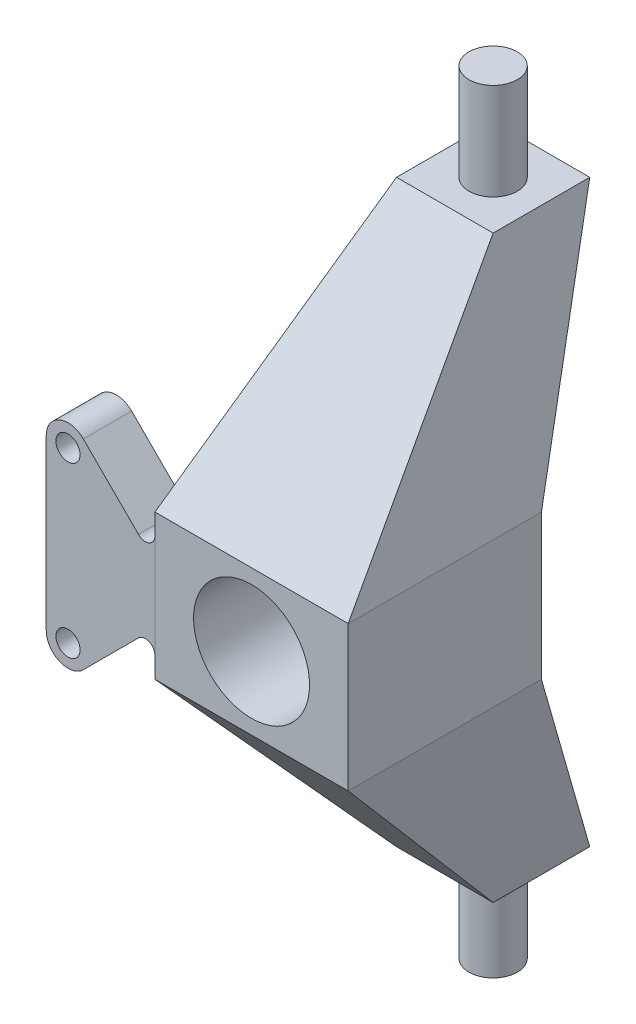
ISO-10303-21;
HEADER;
FILE_DESCRIPTION(('STEP AP214'),'2;1');
FILE_NAME('part.step','',(''),(''),'','','');
FILE_SCHEMA(('AUTOMOTIVE_DESIGN { 1 0 10303 214 1 1 1 1 }'));
ENDSEC;
DATA;
#1=APPLICATION_CONTEXT('core data for automotive mechanical design processes');
#2=APPLICATION_PROTOCOL_DEFINITION('international standard','automotive_design',2000,#1);
#3=PRODUCT_CONTEXT('',#1,'mechanical');
#4=PRODUCT('Part','Part','',(#3));
#5=PRODUCT_RELATED_PRODUCT_CATEGORY('part','',(#4));
#6=PRODUCT_DEFINITION_FORMATION('','',#4);
#7=PRODUCT_DEFINITION_CONTEXT('part definition',#1,'design');
#8=PRODUCT_DEFINITION('design','',#6,#7);
#9=PRODUCT_DEFINITION_SHAPE('','',#8);
#10=(LENGTH_UNIT() NAMED_UNIT(*) SI_UNIT(.MILLI.,.METRE.));
#11=(NAMED_UNIT(*) PLANE_ANGLE_UNIT() SI_UNIT($,.RADIAN.));
#12=(NAMED_UNIT(*) SI_UNIT($,.STERADIAN.) SOLID_ANGLE_UNIT());
#13=UNCERTAINTY_MEASURE_WITH_UNIT(LENGTH_MEASURE(1.E-05),#10,'distance_accuracy_value','');
#14=(GEOMETRIC_REPRESENTATION_CONTEXT(3) GLOBAL_UNCERTAINTY_ASSIGNED_CONTEXT((#13)) GLOBAL_UNIT_ASSIGNED_CONTEXT((#10,
#11,#12)) REPRESENTATION_CONTEXT('',''));
#15=CARTESIAN_POINT('',(0.,0.,0.));
#16=DIRECTION('',(0.,0.,1.));
#17=DIRECTION('',(1.,0.,0.));
#18=AXIS2_PLACEMENT_3D('',#15,#16,#17);
#19=CARTESIAN_POINT('',(-38.,17.5,10.));
#20=DIRECTION('',(0.,0.,1.));
#21=DIRECTION('',(1.,0.,0.));
#22=AXIS2_PLACEMENT_3D('',#19,#20,#21);
#23=CYLINDRICAL_SURFACE('',#22,4.50000000000001);
#24=CARTESIAN_POINT('',(-38.,17.5,20.));
#25=DIRECTION('',(0.,0.,1.));
#26=DIRECTION('',(1.,0.,0.));
#27=AXIS2_PLACEMENT_3D('',#24,#25,#26);
#28=CIRCLE('',#27,4.50000000000001);
#29=CARTESIAN_POINT('',(-42.5,17.5,20.));
#30=VERTEX_POINT('',#29);
#31=CARTESIAN_POINT('',(-34.8180194846605,20.6819805153395,20.));
#32=VERTEX_POINT('',#31);
#33=EDGE_CURVE('E150',#30,#32,#28,.F.);
#34=ORIENTED_EDGE('',*,*,#33,.T.);
#35=DIRECTION('',(0.,0.,1.));
#36=VECTOR('',#35,1.);
#37=CARTESIAN_POINT('',(-34.8180194846605,20.6819805153395,10.));
#38=LINE('',#37,#36);
#39=CARTESIAN_POINT('',(-34.8180194846605,20.6819805153395,10.));
#40=VERTEX_POINT('',#39);
#41=EDGE_CURVE('E12',#40,#32,#38,.T.);
#42=ORIENTED_EDGE('',*,*,#41,.F.);
#43=CARTESIAN_POINT('',(-38.,17.5,10.));
#44=DIRECTION('',(0.,0.,1.));
#45=DIRECTION('',(1.,0.,0.));
#46=AXIS2_PLACEMENT_3D('',#43,#44,#45);
#47=CIRCLE('',#46,4.50000000000001);
#48=CARTESIAN_POINT('',(-42.5,17.5,10.));
#49=VERTEX_POINT('',#48);
#50=EDGE_CURVE('E68',#49,#40,#47,.F.);
#51=ORIENTED_EDGE('',*,*,#50,.F.);
#52=DIRECTION('',(0.,0.,1.));
#53=VECTOR('',#52,1.);
#54=CARTESIAN_POINT('',(-42.5,17.5,10.));
#55=LINE('',#54,#53);
#56=EDGE_CURVE('E53',#49,#30,#55,.T.);
#57=ORIENTED_EDGE('',*,*,#56,.T.);
#58=EDGE_LOOP('',(#34,#42,#51,#57));
#59=FACE_BOUND('',#58,.T.);
#60=ADVANCED_FACE('F49',(#59),#23,.T.);
#61=CARTESIAN_POINT('',(-7.06801948466046,-7.06801948466049,10.));
#62=DIRECTION('',(0.707106781186546,0.707106781186549,0.));
#63=DIRECTION('',(-0.707106781186549,0.707106781186546,0.));
#64=AXIS2_PLACEMENT_3D('',#61,#62,#63);
#65=PLANE('',#64);
#66=DIRECTION('',(-0.707106781186549,0.707106781186546,0.));
#67=VECTOR('',#66,1.);
#68=CARTESIAN_POINT('',(-7.06801948466046,-7.06801948466049,20.));
#69=LINE('',#68,#67);
#70=CARTESIAN_POINT('',(-23.4142135623731,9.27817459305209,20.));
#71=VERTEX_POINT('',#70);
#72=EDGE_CURVE('E167',#71,#32,#69,.T.);
#73=ORIENTED_EDGE('',*,*,#72,.F.);
#74=DIRECTION('',(0.,0.,1.));
#75=VECTOR('',#74,1.);
#76=CARTESIAN_POINT('',(-23.4142135623731,9.27817459305209,10.));
#77=LINE('',#76,#75);
#78=CARTESIAN_POINT('',(-23.4142135623731,9.27817459305209,10.));
#79=VERTEX_POINT('',#78);
#80=EDGE_CURVE('E59',#79,#71,#77,.T.);
#81=ORIENTED_EDGE('',*,*,#80,.F.);
#82=DIRECTION('',(-0.707106781186549,0.707106781186546,0.));
#83=VECTOR('',#82,1.);
#84=CARTESIAN_POINT('',(-7.06801948466046,-7.06801948466049,10.));
#85=LINE('',#84,#83);
#86=EDGE_CURVE('E139',#79,#40,#85,.T.);
#87=ORIENTED_EDGE('',*,*,#86,.T.);
#88=ORIENTED_EDGE('',*,*,#41,.T.);
#89=EDGE_LOOP('',(#73,#81,#87,#88));
#90=FACE_BOUND('',#89,.T.);
#91=ADVANCED_FACE('F197',(#90),#65,.T.);
#92=CARTESIAN_POINT('',(-22.,10.6923881554252,10.));
#93=DIRECTION('',(0.,0.,1.));
#94=DIRECTION('',(1.,0.,0.));
#95=AXIS2_PLACEMENT_3D('',#92,#93,#94);
#96=CYLINDRICAL_SURFACE('',#95,2.);
#97=CARTESIAN_POINT('',(-22.,10.6923881554252,20.));
#98=DIRECTION('',(0.,0.,1.));
#99=DIRECTION('',(1.,0.,0.));
#100=AXIS2_PLACEMENT_3D('',#97,#98,#99);
#101=CIRCLE('',#100,2.);
#102=CARTESIAN_POINT('',(-20.,10.6923881554252,20.));
#103=VERTEX_POINT('',#102);
#104=EDGE_CURVE('E126',#103,#71,#101,.F.);
#105=ORIENTED_EDGE('',*,*,#104,.F.);
#106=DIRECTION('',(0.,0.,1.));
#107=VECTOR('',#106,1.);
#108=CARTESIAN_POINT('',(-20.,10.6923881554252,10.));
#109=LINE('',#108,#107);
#110=CARTESIAN_POINT('',(-20.,10.6923881554252,10.));
#111=VERTEX_POINT('',#110);
#112=EDGE_CURVE('E121',#111,#103,#109,.T.);
#113=ORIENTED_EDGE('',*,*,#112,.F.);
#114=CARTESIAN_POINT('',(-22.,10.6923881554252,10.));
#115=DIRECTION('',(0.,0.,1.));
#116=DIRECTION('',(1.,0.,0.));
#117=AXIS2_PLACEMENT_3D('',#114,#115,#116);
#118=CIRCLE('',#117,2.);
#119=EDGE_CURVE('E125',#111,#79,#118,.F.);
#120=ORIENTED_EDGE('',*,*,#119,.T.);
#121=ORIENTED_EDGE('',*,*,#80,.T.);
#122=EDGE_LOOP('',(#105,#113,#120,#121));
#123=FACE_BOUND('',#122,.T.);
#124=ADVANCED_FACE('F123',(#123),#96,.F.);
#125=CARTESIAN_POINT('',(-20.,0.,10.));
#126=DIRECTION('',(-1.,0.,0.));
#127=DIRECTION('',(0.,0.,1.));
#128=AXIS2_PLACEMENT_3D('',#125,#126,#127);
#129=PLANE('',#128);
#130=DIRECTION('',(0.,-1.,0.));
#131=VECTOR('',#130,1.);
#132=CARTESIAN_POINT('',(-20.,0.,20.));
#133=LINE('',#132,#131);
#134=CARTESIAN_POINT('',(-20.,-10.6923881554251,20.));
#135=VERTEX_POINT('',#134);
#136=EDGE_CURVE('E164',#103,#135,#133,.T.);
#137=ORIENTED_EDGE('',*,*,#136,.T.);
#138=DIRECTION('',(0.,0.,1.));
#139=VECTOR('',#138,1.);
#140=CARTESIAN_POINT('',(-20.,-10.6923881554251,10.));
#141=LINE('',#140,#139);
#142=CARTESIAN_POINT('',(-20.,-10.6923881554251,10.));
#143=VERTEX_POINT('',#142);
#144=EDGE_CURVE('E129',#143,#135,#141,.T.);
#145=ORIENTED_EDGE('',*,*,#144,.F.);
#146=DIRECTION('',(0.,-1.,0.));
#147=VECTOR('',#146,1.);
#148=CARTESIAN_POINT('',(-20.,0.,10.));
#149=LINE('',#148,#147);
#150=EDGE_CURVE('E132',#111,#143,#149,.T.);
#151=ORIENTED_EDGE('',*,*,#150,.F.);
#152=ORIENTED_EDGE('',*,*,#112,.T.);
#153=EDGE_LOOP('',(#137,#145,#151,#152));
#154=FACE_BOUND('',#153,.T.);
#155=ADVANCED_FACE('F133',(#154),#129,.F.);
#156=CARTESIAN_POINT('',(-22.,-10.6923881554251,10.));
#157=DIRECTION('',(0.,0.,1.));
#158=DIRECTION('',(1.,0.,0.));
#159=AXIS2_PLACEMENT_3D('',#156,#157,#158);
#160=CYLINDRICAL_SURFACE('',#159,2.);
#161=CARTESIAN_POINT('',(-22.,-10.6923881554251,20.));
#162=DIRECTION('',(0.,0.,1.));
#163=DIRECTION('',(1.,0.,0.));
#164=AXIS2_PLACEMENT_3D('',#161,#162,#163);
#165=CIRCLE('',#164,2.);
#166=CARTESIAN_POINT('',(-23.4142135623731,-9.27817459305205,20.));
#167=VERTEX_POINT('',#166);
#168=EDGE_CURVE('E161',#135,#167,#165,.T.);
#169=ORIENTED_EDGE('',*,*,#168,.T.);
#170=DIRECTION('',(0.,0.,1.));
#171=VECTOR('',#170,1.);
#172=CARTESIAN_POINT('',(-23.4142135623731,-9.27817459305205,10.));
#173=LINE('',#172,#171);
#174=CARTESIAN_POINT('',(-23.4142135623731,-9.27817459305205,10.));
#175=VERTEX_POINT('',#174);
#176=EDGE_CURVE('E173',#175,#167,#173,.T.);
#177=ORIENTED_EDGE('',*,*,#176,.F.);
#178=CARTESIAN_POINT('',(-22.,-10.6923881554251,10.));
#179=DIRECTION('',(0.,0.,1.));
#180=DIRECTION('',(1.,0.,0.));
#181=AXIS2_PLACEMENT_3D('',#178,#179,#180);
#182=CIRCLE('',#181,2.);
#183=EDGE_CURVE('E136',#143,#175,#182,.T.);
#184=ORIENTED_EDGE('',*,*,#183,.F.);
#185=ORIENTED_EDGE('',*,*,#144,.T.);
#186=EDGE_LOOP('',(#169,#177,#184,#185));
#187=FACE_BOUND('',#186,.T.);
#188=ADVANCED_FACE('F227',(#187),#160,.F.);
#189=CARTESIAN_POINT('',(-7.06801948466048,7.06801948466051,10.));
#190=DIRECTION('',(0.707106781186546,-0.707106781186549,0.));
#191=DIRECTION('',(0.707106781186549,0.707106781186546,0.));
#192=AXIS2_PLACEMENT_3D('',#189,#190,#191);
#193=PLANE('',#192);
#194=DIRECTION('',(0.707106781186549,0.707106781186546,0.));
#195=VECTOR('',#194,1.);
#196=CARTESIAN_POINT('',(-7.06801948466048,7.06801948466051,20.));
#197=LINE('',#196,#195);
#198=CARTESIAN_POINT('',(-34.8180194846605,-20.6819805153395,20.));
#199=VERTEX_POINT('',#198);
#200=EDGE_CURVE('E158',#199,#167,#197,.T.);
#201=ORIENTED_EDGE('',*,*,#200,.F.);
#202=DIRECTION('',(0.,0.,1.));
#203=VECTOR('',#202,1.);
#204=CARTESIAN_POINT('',(-34.8180194846605,-20.6819805153395,10.));
#205=LINE('',#204,#203);
#206=CARTESIAN_POINT('',(-34.8180194846605,-20.6819805153395,10.));
#207=VERTEX_POINT('',#206);
#208=EDGE_CURVE('E175',#207,#199,#205,.T.);
#209=ORIENTED_EDGE('',*,*,#208,.F.);
#210=DIRECTION('',(0.707106781186549,0.707106781186546,0.));
#211=VECTOR('',#210,1.);
#212=CARTESIAN_POINT('',(-7.06801948466048,7.06801948466051,10.));
#213=LINE('',#212,#211);
#214=EDGE_CURVE('E242',#207,#175,#213,.T.);
#215=ORIENTED_EDGE('',*,*,#214,.T.);
#216=ORIENTED_EDGE('',*,*,#176,.T.);
#217=EDGE_LOOP('',(#201,#209,#215,#216));
#218=FACE_BOUND('',#217,.T.);
#219=ADVANCED_FACE('F208',(#218),#193,.T.);
#220=CARTESIAN_POINT('',(-38.,-17.5,10.));
#221=DIRECTION('',(0.,0.,1.));
#222=DIRECTION('',(1.,0.,0.));
#223=AXIS2_PLACEMENT_3D('',#220,#221,#222);
#224=CYLINDRICAL_SURFACE('',#223,4.50000000000001);
#225=CARTESIAN_POINT('',(-38.,-17.5,20.));
#226=DIRECTION('',(0.,0.,1.));
#227=DIRECTION('',(1.,0.,0.));
#228=AXIS2_PLACEMENT_3D('',#225,#226,#227);
#229=CIRCLE('',#228,4.50000000000001);
#230=CARTESIAN_POINT('',(-42.5,-17.5,20.));
#231=VERTEX_POINT('',#230);
#232=EDGE_CURVE('E155',#199,#231,#229,.F.);
#233=ORIENTED_EDGE('',*,*,#232,.T.);
#234=DIRECTION('',(0.,0.,1.));
#235=VECTOR('',#234,1.);
#236=CARTESIAN_POINT('',(-42.5,-17.5,10.));
#237=LINE('',#236,#235);
#238=CARTESIAN_POINT('',(-42.5,-17.5,10.));
#239=VERTEX_POINT('',#238);
#240=EDGE_CURVE('E176',#239,#231,#237,.T.);
#241=ORIENTED_EDGE('',*,*,#240,.F.);
#242=CARTESIAN_POINT('',(-38.,-17.5,10.));
#243=DIRECTION('',(0.,0.,1.));
#244=DIRECTION('',(1.,0.,0.));
#245=AXIS2_PLACEMENT_3D('',#242,#243,#244);
#246=CIRCLE('',#245,4.50000000000001);
#247=EDGE_CURVE('E240',#207,#239,#246,.F.);
#248=ORIENTED_EDGE('',*,*,#247,.F.);
#249=ORIENTED_EDGE('',*,*,#208,.T.);
#250=EDGE_LOOP('',(#233,#241,#248,#249));
#251=FACE_BOUND('',#250,.T.);
#252=ADVANCED_FACE('F203',(#251),#224,.T.);
#253=CARTESIAN_POINT('',(-38.,17.5,10.));
#254=DIRECTION('',(0.,0.,1.));
#255=DIRECTION('',(1.,0.,0.));
#256=AXIS2_PLACEMENT_3D('',#253,#254,#255);
#257=CYLINDRICAL_SURFACE('',#256,2.5);
#258=CARTESIAN_POINT('',(-38.,17.5,10.));
#259=DIRECTION('',(0.,0.,1.));
#260=DIRECTION('',(1.,0.,0.));
#261=AXIS2_PLACEMENT_3D('',#258,#259,#260);
#262=CIRCLE('',#261,2.5);
#263=CARTESIAN_POINT('',(-35.5,17.5,10.));
#264=VERTEX_POINT('',#263);
#265=EDGE_CURVE('E213',#264,#264,#262,.T.);
#266=ORIENTED_EDGE('',*,*,#265,.F.);
#267=EDGE_LOOP('',(#266));
#268=FACE_BOUND('',#267,.T.);
#269=CARTESIAN_POINT('',(-38.,17.5,20.));
#270=DIRECTION('',(0.,0.,1.));
#271=DIRECTION('',(1.,0.,0.));
#272=AXIS2_PLACEMENT_3D('',#269,#270,#271);
#273=CIRCLE('',#272,2.5);
#274=CARTESIAN_POINT('',(-35.5,17.5,20.));
#275=VERTEX_POINT('',#274);
#276=EDGE_CURVE('E147',#275,#275,#273,.T.);
#277=ORIENTED_EDGE('',*,*,#276,.T.);
#278=EDGE_LOOP('',(#277));
#279=FACE_BOUND('',#278,.T.);
#280=ADVANCED_FACE('F192',(#268,#279),#257,.F.);
#281=CARTESIAN_POINT('',(-38.,-17.5,10.));
#282=DIRECTION('',(0.,0.,1.));
#283=DIRECTION('',(1.,0.,0.));
#284=AXIS2_PLACEMENT_3D('',#281,#282,#283);
#285=CYLINDRICAL_SURFACE('',#284,2.5);
#286=CARTESIAN_POINT('',(-38.,-17.5,10.));
#287=DIRECTION('',(0.,0.,1.));
#288=DIRECTION('',(1.,0.,0.));
#289=AXIS2_PLACEMENT_3D('',#286,#287,#288);
#290=CIRCLE('',#289,2.5);
#291=CARTESIAN_POINT('',(-35.5,-17.5,10.));
#292=VERTEX_POINT('',#291);
#293=EDGE_CURVE('E169',#292,#292,#290,.T.);
#294=ORIENTED_EDGE('',*,*,#293,.F.);
#295=EDGE_LOOP('',(#294));
#296=FACE_BOUND('',#295,.T.);
#297=CARTESIAN_POINT('',(-38.,-17.5,20.));
#298=DIRECTION('',(0.,0.,1.));
#299=DIRECTION('',(1.,0.,0.));
#300=AXIS2_PLACEMENT_3D('',#297,#298,#299);
#301=CIRCLE('',#300,2.5);
#302=CARTESIAN_POINT('',(-35.5,-17.5,20.));
#303=VERTEX_POINT('',#302);
#304=EDGE_CURVE('E144',#303,#303,#301,.T.);
#305=ORIENTED_EDGE('',*,*,#304,.T.);
#306=EDGE_LOOP('',(#305));
#307=FACE_BOUND('',#306,.T.);
#308=ADVANCED_FACE('F51',(#296,#307),#285,.F.);
#309=CARTESIAN_POINT('',(-42.5,0.,10.));
#310=DIRECTION('',(-1.,0.,0.));
#311=DIRECTION('',(0.,0.,1.));
#312=AXIS2_PLACEMENT_3D('',#309,#310,#311);
#313=PLANE('',#312);
#314=DIRECTION('',(0.,-1.,0.));
#315=VECTOR('',#314,1.);
#316=CARTESIAN_POINT('',(-42.5,0.,20.));
#317=LINE('',#316,#315);
#318=EDGE_CURVE('E152',#30,#231,#317,.T.);
#319=ORIENTED_EDGE('',*,*,#318,.F.);
#320=ORIENTED_EDGE('',*,*,#56,.F.);
#321=DIRECTION('',(0.,-1.,0.));
#322=VECTOR('',#321,1.);
#323=CARTESIAN_POINT('',(-42.5,0.,10.));
#324=LINE('',#323,#322);
#325=EDGE_CURVE('E243',#49,#239,#324,.T.);
#326=ORIENTED_EDGE('',*,*,#325,.T.);
#327=ORIENTED_EDGE('',*,*,#240,.T.);
#328=EDGE_LOOP('',(#319,#320,#326,#327));
#329=FACE_BOUND('',#328,.T.);
#330=ADVANCED_FACE('F183',(#329),#313,.T.);
#331=CARTESIAN_POINT('',(0.,0.,10.));
#332=DIRECTION('',(0.,0.,1.));
#333=DIRECTION('',(1.,0.,0.));
#334=AXIS2_PLACEMENT_3D('',#331,#332,#333);
#335=PLANE('',#334);
#336=ORIENTED_EDGE('',*,*,#293,.T.);
#337=EDGE_LOOP('',(#336));
#338=FACE_BOUND('',#337,.T.);
#339=ORIENTED_EDGE('',*,*,#265,.T.);
#340=EDGE_LOOP('',(#339));
#341=FACE_BOUND('',#340,.T.);
#342=ORIENTED_EDGE('',*,*,#50,.T.);
#343=ORIENTED_EDGE('',*,*,#86,.F.);
#344=ORIENTED_EDGE('',*,*,#119,.F.);
#345=ORIENTED_EDGE('',*,*,#150,.T.);
#346=ORIENTED_EDGE('',*,*,#183,.T.);
#347=ORIENTED_EDGE('',*,*,#214,.F.);
#348=ORIENTED_EDGE('',*,*,#247,.T.);
#349=ORIENTED_EDGE('',*,*,#325,.F.);
#350=EDGE_LOOP('',(#342,#343,#344,#345,#346,#347,#348,#349));
#351=FACE_BOUND('',#350,.T.);
#352=ADVANCED_FACE('F138',(#338,#341,#351),#335,.F.);
#353=CARTESIAN_POINT('',(0.,0.,20.));
#354=DIRECTION('',(0.,0.,1.));
#355=DIRECTION('',(1.,0.,0.));
#356=AXIS2_PLACEMENT_3D('',#353,#354,#355);
#357=PLANE('',#356);
#358=ORIENTED_EDGE('',*,*,#304,.F.);
#359=EDGE_LOOP('',(#358));
#360=FACE_BOUND('',#359,.T.);
#361=ORIENTED_EDGE('',*,*,#276,.F.);
#362=EDGE_LOOP('',(#361));
#363=FACE_BOUND('',#362,.T.);
#364=ORIENTED_EDGE('',*,*,#33,.F.);
#365=ORIENTED_EDGE('',*,*,#318,.T.);
#366=ORIENTED_EDGE('',*,*,#232,.F.);
#367=ORIENTED_EDGE('',*,*,#200,.T.);
#368=ORIENTED_EDGE('',*,*,#168,.F.);
#369=ORIENTED_EDGE('',*,*,#136,.F.);
#370=ORIENTED_EDGE('',*,*,#104,.T.);
#371=ORIENTED_EDGE('',*,*,#72,.T.);
#372=EDGE_LOOP('',(#364,#365,#366,#367,#368,#369,#370,#371));
#373=FACE_BOUND('',#372,.T.);
#374=ADVANCED_FACE('F181',(#360,#363,#373),#357,.T.);
#375=CLOSED_SHELL('',(#60,#91,#124,#155,#188,#219,#252,#280,#308,#330,#352,#374));
#376=MANIFOLD_SOLID_BREP('B2',#375);
#377=CARTESIAN_POINT('',(20.,-16.551724137931,18.6206896551724));
#378=DIRECTION('',(0.,0.66436383882992,-0.74740931868366));
#379=DIRECTION('',(0.,0.74740931868366,0.66436383882992));
#380=AXIS2_PLACEMENT_3D('',#377,#378,#379);
#381=PLANE('',#380);
#382=DIRECTION('',(-1.,0.,0.));
#383=VECTOR('',#382,1.);
#384=CARTESIAN_POINT('',(20.,-60.,-19.9999999999999));
#385=LINE('',#384,#383);
#386=CARTESIAN_POINT('',(9.99999999999999,-60.,-19.9999999999999));
#387=VERTEX_POINT('',#386);
#388=CARTESIAN_POINT('',(-10.,-60.,-19.9999999999999));
#389=VERTEX_POINT('',#388);
#390=EDGE_CURVE('E412',#387,#389,#385,.T.);
#391=ORIENTED_EDGE('',*,*,#390,.F.);
#392=DIRECTION('',(0.163846384103808,0.737308728467137,0.655385536415232));
#393=VECTOR('',#392,1.);
#394=CARTESIAN_POINT('',(19.6644295302013,-16.510067114094,18.6577181208054));
#395=LINE('',#394,#393);
#396=CARTESIAN_POINT('',(20.,-15.,20.0000025));
#397=VERTEX_POINT('',#396);
#398=EDGE_CURVE('E397',#387,#397,#395,.T.);
#399=ORIENTED_EDGE('',*,*,#398,.T.);
#400=DIRECTION('',(-1.,0.,0.));
#401=VECTOR('',#400,1.);
#402=CARTESIAN_POINT('',(20.,-15.,20.));
#403=LINE('',#402,#401);
#404=CARTESIAN_POINT('',(-20.,-15.,20.));
#405=VERTEX_POINT('',#404);
#406=EDGE_CURVE('E409',#397,#405,#403,.T.);
#407=ORIENTED_EDGE('',*,*,#406,.T.);
#408=DIRECTION('',(-0.163846384103808,0.737308728467137,0.655385536415232));
#409=VECTOR('',#408,1.);
#410=CARTESIAN_POINT('',(-18.5906040268456,-21.3422818791946,14.3624161073826));
#411=LINE('',#410,#409);
#412=EDGE_CURVE('E414',#389,#405,#411,.T.);
#413=ORIENTED_EDGE('',*,*,#412,.F.);
#414=EDGE_LOOP('',(#391,#399,#407,#413));
#415=FACE_BOUND('',#414,.T.);
#416=ADVANCED_FACE('F322',(#415),#381,.F.);
#417=CARTESIAN_POINT('',(20.,-60.,0.));
#418=DIRECTION('',(0.,1.,0.));
#419=DIRECTION('',(0.,0.,1.));
#420=AXIS2_PLACEMENT_3D('',#417,#418,#419);
#421=PLANE('',#420);
#422=CARTESIAN_POINT('',(0.,-60.,-30.));
#423=DIRECTION('',(0.,1.,0.));
#424=DIRECTION('',(0.,0.,1.));
#425=AXIS2_PLACEMENT_3D('',#422,#423,#424);
#426=CIRCLE('',#425,5.);
#427=CARTESIAN_POINT('',(0.,-60.,-25.));
#428=VERTEX_POINT('',#427);
#429=EDGE_CURVE('E484',#428,#428,#426,.T.);
#430=ORIENTED_EDGE('',*,*,#429,.T.);
#431=EDGE_LOOP('',(#430));
#432=FACE_BOUND('',#431,.T.);
#433=DIRECTION('',(-1.,0.,0.));
#434=VECTOR('',#433,1.);
#435=CARTESIAN_POINT('',(20.,-60.,-39.9999999999999));
#436=LINE('',#435,#434);
#437=CARTESIAN_POINT('',(9.99999999999999,-60.,-39.9999999999999));
#438=VERTEX_POINT('',#437);
#439=CARTESIAN_POINT('',(-10.,-60.,-40.));
#440=VERTEX_POINT('',#439);
#441=EDGE_CURVE('E430',#438,#440,#436,.T.);
#442=ORIENTED_EDGE('',*,*,#441,.F.);
#443=DIRECTION('',(0.,0.,1.));
#444=VECTOR('',#443,1.);
#445=CARTESIAN_POINT('',(9.99999999999999,-60.,-40.));
#446=LINE('',#445,#444);
#447=EDGE_CURVE('E339',#438,#387,#446,.T.);
#448=ORIENTED_EDGE('',*,*,#447,.T.);
#449=ORIENTED_EDGE('',*,*,#390,.T.);
#450=DIRECTION('',(0.,0.,1.));
#451=VECTOR('',#450,1.);
#452=CARTESIAN_POINT('',(-10.,-60.,-40.));
#453=LINE('',#452,#451);
#454=EDGE_CURVE('E402',#440,#389,#453,.T.);
#455=ORIENTED_EDGE('',*,*,#454,.F.);
#456=EDGE_LOOP('',(#442,#448,#449,#455));
#457=FACE_BOUND('',#456,.T.);
#458=ADVANCED_FACE('F523',(#432,#457),#421,.F.);
#459=CARTESIAN_POINT('',(20.,4.9484536082474,-11.1340206185566));
#460=DIRECTION('',(0.,-0.406138466053448,0.913811548620257));
#461=DIRECTION('',(0.,-0.913811548620257,-0.406138466053448));
#462=AXIS2_PLACEMENT_3D('',#459,#460,#461);
#463=PLANE('',#462);
#464=DIRECTION('',(-1.,0.,0.));
#465=VECTOR('',#464,1.);
#466=CARTESIAN_POINT('',(20.,-15.,-19.9999999999999));
#467=LINE('',#466,#465);
#468=CARTESIAN_POINT('',(20.,-15.,-19.9999999999999));
#469=VERTEX_POINT('',#468);
#470=CARTESIAN_POINT('',(-20.,-15.,-19.9999999999999));
#471=VERTEX_POINT('',#470);
#472=EDGE_CURVE('E426',#469,#471,#467,.T.);
#473=ORIENTED_EDGE('',*,*,#472,.F.);
#474=DIRECTION('',(-0.199007438041998,-0.89553347118899,-0.398014876083996));
#475=VECTOR('',#474,1.);
#476=CARTESIAN_POINT('',(24.2574257425743,4.15841584158413,-11.4851485148514));
#477=LINE('',#476,#475);
#478=EDGE_CURVE('E47',#469,#438,#477,.T.);
#479=ORIENTED_EDGE('',*,*,#478,.T.);
#480=ORIENTED_EDGE('',*,*,#441,.T.);
#481=DIRECTION('',(0.199007438041998,-0.89553347118899,-0.398014876083996));
#482=VECTOR('',#481,1.);
#483=CARTESIAN_POINT('',(-22.6732673267327,-2.97029702970299,-14.6534653465346));
#484=LINE('',#483,#482);
#485=EDGE_CURVE('E511',#471,#440,#484,.T.);
#486=ORIENTED_EDGE('',*,*,#485,.F.);
#487=EDGE_LOOP('',(#473,#479,#480,#486));
#488=FACE_BOUND('',#487,.T.);
#489=ADVANCED_FACE('F520',(#488),#463,.F.);
#490=CARTESIAN_POINT('',(-20.,0.,0.));
#491=DIRECTION('',(1.,0.,0.));
#492=DIRECTION('',(0.,0.,-1.));
#493=AXIS2_PLACEMENT_3D('',#490,#491,#492);
#494=PLANE('',#493);
#495=DIRECTION('',(0.,0.,-1.));
#496=VECTOR('',#495,1.);
#497=CARTESIAN_POINT('',(-20.,-15.,0.));
#498=LINE('',#497,#496);
#499=EDGE_CURVE('E331',#405,#471,#498,.T.);
#500=ORIENTED_EDGE('',*,*,#499,.F.);
#501=DIRECTION('',(0.,1.,0.));
#502=VECTOR('',#501,1.);
#503=CARTESIAN_POINT('',(-20.,0.,20.));
#504=LINE('',#503,#502);
#505=CARTESIAN_POINT('',(-20.,15.,20.));
#506=VERTEX_POINT('',#505);
#507=EDGE_CURVE('E422',#405,#506,#504,.T.);
#508=ORIENTED_EDGE('',*,*,#507,.T.);
#509=DIRECTION('',(0.,0.,-1.));
#510=VECTOR('',#509,1.);
#511=CARTESIAN_POINT('',(-20.,15.,0.));
#512=LINE('',#511,#510);
#513=CARTESIAN_POINT('',(-20.,15.,-20.));
#514=VERTEX_POINT('',#513);
#515=EDGE_CURVE('E445',#506,#514,#512,.T.);
#516=ORIENTED_EDGE('',*,*,#515,.T.);
#517=DIRECTION('',(0.,-1.,0.));
#518=VECTOR('',#517,1.);
#519=CARTESIAN_POINT('',(-20.,0.,-20.));
#520=LINE('',#519,#518);
#521=EDGE_CURVE('E452',#514,#471,#520,.T.);
#522=ORIENTED_EDGE('',*,*,#521,.T.);
#523=EDGE_LOOP('',(#500,#508,#516,#522));
#524=FACE_BOUND('',#523,.T.);
#525=ADVANCED_FACE('F515',(#524),#494,.F.);
#526=CARTESIAN_POINT('',(20.,-4.94845360824742,-11.1340206185567));
#527=DIRECTION('',(0.,-0.406138466053448,-0.913811548620257));
#528=DIRECTION('',(0.,0.913811548620257,-0.406138466053448));
#529=AXIS2_PLACEMENT_3D('',#526,#527,#528);
#530=PLANE('',#529);
#531=DIRECTION('',(-1.,0.,0.));
#532=VECTOR('',#531,1.);
#533=CARTESIAN_POINT('',(20.,60.,-40.));
#534=LINE('',#533,#532);
#535=CARTESIAN_POINT('',(9.99999999999999,60.,-40.));
#536=VERTEX_POINT('',#535);
#537=CARTESIAN_POINT('',(-10.,60.,-40.));
#538=VERTEX_POINT('',#537);
#539=EDGE_CURVE('E467',#536,#538,#534,.T.);
#540=ORIENTED_EDGE('',*,*,#539,.F.);
#541=DIRECTION('',(0.199007438041998,-0.89553347118899,0.398014876083996));
#542=VECTOR('',#541,1.);
#543=CARTESIAN_POINT('',(24.2574257425743,-4.15841584158415,-11.4851485148515));
#544=LINE('',#543,#542);
#545=CARTESIAN_POINT('',(20.,15.,-20.));
#546=VERTEX_POINT('',#545);
#547=EDGE_CURVE('E487',#536,#546,#544,.T.);
#548=ORIENTED_EDGE('',*,*,#547,.T.);
#549=DIRECTION('',(-1.,0.,0.));
#550=VECTOR('',#549,1.);
#551=CARTESIAN_POINT('',(20.,15.,-20.));
#552=LINE('',#551,#550);
#553=EDGE_CURVE('E464',#546,#514,#552,.T.);
#554=ORIENTED_EDGE('',*,*,#553,.T.);
#555=DIRECTION('',(-0.199007438041998,-0.89553347118899,0.398014876083996));
#556=VECTOR('',#555,1.);
#557=CARTESIAN_POINT('',(-22.6732673267327,2.97029702970297,-14.6534653465346));
#558=LINE('',#557,#556);
#559=EDGE_CURVE('E360',#538,#514,#558,.T.);
#560=ORIENTED_EDGE('',*,*,#559,.F.);
#561=EDGE_LOOP('',(#540,#548,#554,#560));
#562=FACE_BOUND('',#561,.T.);
#563=ADVANCED_FACE('F545',(#562),#530,.T.);
#564=CARTESIAN_POINT('',(20.,60.,0.));
#565=DIRECTION('',(0.,1.,0.));
#566=DIRECTION('',(0.,0.,1.));
#567=AXIS2_PLACEMENT_3D('',#564,#565,#566);
#568=PLANE('',#567);
#569=CARTESIAN_POINT('',(0.,60.,-30.));
#570=DIRECTION('',(0.,1.,0.));
#571=DIRECTION('',(0.,0.,1.));
#572=AXIS2_PLACEMENT_3D('',#569,#570,#571);
#573=CIRCLE('',#572,5.);
#574=CARTESIAN_POINT('',(0.,60.,-25.));
#575=VERTEX_POINT('',#574);
#576=EDGE_CURVE('E446',#575,#575,#573,.T.);
#577=ORIENTED_EDGE('',*,*,#576,.F.);
#578=EDGE_LOOP('',(#577));
#579=FACE_BOUND('',#578,.T.);
#580=DIRECTION('',(-1.,0.,0.));
#581=VECTOR('',#580,1.);
#582=CARTESIAN_POINT('',(20.,60.,-20.));
#583=LINE('',#582,#581);
#584=CARTESIAN_POINT('',(9.99999999999999,60.,-20.));
#585=VERTEX_POINT('',#584);
#586=CARTESIAN_POINT('',(-10.,60.,-20.));
#587=VERTEX_POINT('',#586);
#588=EDGE_CURVE('E456',#585,#587,#583,.T.);
#589=ORIENTED_EDGE('',*,*,#588,.F.);
#590=DIRECTION('',(0.,0.,1.));
#591=VECTOR('',#590,1.);
#592=CARTESIAN_POINT('',(9.99999999999999,60.,-40.));
#593=LINE('',#592,#591);
#594=EDGE_CURVE('E368',#536,#585,#593,.T.);
#595=ORIENTED_EDGE('',*,*,#594,.F.);
#596=ORIENTED_EDGE('',*,*,#539,.T.);
#597=DIRECTION('',(0.,0.,1.));
#598=VECTOR('',#597,1.);
#599=CARTESIAN_POINT('',(-10.,60.,-40.));
#600=LINE('',#599,#598);
#601=EDGE_CURVE('E413',#538,#587,#600,.T.);
#602=ORIENTED_EDGE('',*,*,#601,.T.);
#603=EDGE_LOOP('',(#589,#595,#596,#602));
#604=FACE_BOUND('',#603,.T.);
#605=ADVANCED_FACE('F542',(#579,#604),#568,.T.);
#606=CARTESIAN_POINT('',(20.,16.551724137931,18.6206896551724));
#607=DIRECTION('',(0.,0.66436383882992,0.74740931868366));
#608=DIRECTION('',(0.,-0.74740931868366,0.66436383882992));
#609=AXIS2_PLACEMENT_3D('',#606,#607,#608);
#610=PLANE('',#609);
#611=DIRECTION('',(-1.,0.,0.));
#612=VECTOR('',#611,1.);
#613=CARTESIAN_POINT('',(20.,15.,20.));
#614=LINE('',#613,#612);
#615=CARTESIAN_POINT('',(20.,15.,20.));
#616=VERTEX_POINT('',#615);
#617=EDGE_CURVE('E423',#616,#506,#614,.T.);
#618=ORIENTED_EDGE('',*,*,#617,.F.);
#619=DIRECTION('',(-0.163846384103808,0.737308728467137,-0.655385536415232));
#620=VECTOR('',#619,1.);
#621=CARTESIAN_POINT('',(19.6644295302013,16.5100671140939,18.6577181208054));
#622=LINE('',#621,#620);
#623=EDGE_CURVE('E347',#616,#585,#622,.T.);
#624=ORIENTED_EDGE('',*,*,#623,.T.);
#625=ORIENTED_EDGE('',*,*,#588,.T.);
#626=DIRECTION('',(0.163846384103808,0.737308728467137,-0.655385536415232));
#627=VECTOR('',#626,1.);
#628=CARTESIAN_POINT('',(-18.5906040268456,21.3422818791946,14.3624161073825));
#629=LINE('',#628,#627);
#630=EDGE_CURVE('E495',#506,#587,#629,.T.);
#631=ORIENTED_EDGE('',*,*,#630,.F.);
#632=EDGE_LOOP('',(#618,#624,#625,#631));
#633=FACE_BOUND('',#632,.T.);
#634=ADVANCED_FACE('F539',(#633),#610,.T.);
#635=CARTESIAN_POINT('',(20.,0.,0.));
#636=DIRECTION('',(1.,0.,0.));
#637=DIRECTION('',(0.,0.,-1.));
#638=AXIS2_PLACEMENT_3D('',#635,#636,#637);
#639=PLANE('',#638);
#640=DIRECTION('',(0.,0.,1.));
#641=VECTOR('',#640,1.);
#642=CARTESIAN_POINT('',(20.,-15.,-40.));
#643=LINE('',#642,#641);
#644=EDGE_CURVE('E394',#469,#397,#643,.T.);
#645=ORIENTED_EDGE('',*,*,#644,.F.);
#646=DIRECTION('',(0.,-1.,0.));
#647=VECTOR('',#646,1.);
#648=CARTESIAN_POINT('',(20.,0.,-20.));
#649=LINE('',#648,#647);
#650=EDGE_CURVE('E427',#546,#469,#649,.T.);
#651=ORIENTED_EDGE('',*,*,#650,.F.);
#652=DIRECTION('',(0.,0.,1.));
#653=VECTOR('',#652,1.);
#654=CARTESIAN_POINT('',(20.,15.,0.));
#655=LINE('',#654,#653);
#656=EDGE_CURVE('E364',#546,#616,#655,.T.);
#657=ORIENTED_EDGE('',*,*,#656,.T.);
#658=DIRECTION('',(0.,1.,0.));
#659=VECTOR('',#658,1.);
#660=CARTESIAN_POINT('',(20.,0.,20.));
#661=LINE('',#660,#659);
#662=EDGE_CURVE('E420',#397,#616,#661,.T.);
#663=ORIENTED_EDGE('',*,*,#662,.F.);
#664=EDGE_LOOP('',(#645,#651,#657,#663));
#665=FACE_BOUND('',#664,.T.);
#666=ADVANCED_FACE('F424',(#665),#639,.T.);
#667=CARTESIAN_POINT('',(20.,0.,-20.));
#668=DIRECTION('',(0.,0.,-1.));
#669=DIRECTION('',(0.,1.,0.));
#670=AXIS2_PLACEMENT_3D('',#667,#668,#669);
#671=PLANE('',#670);
#672=CARTESIAN_POINT('',(0.,0.,-20.));
#673=DIRECTION('',(0.,0.,-1.));
#674=DIRECTION('',(0.,1.,0.));
#675=AXIS2_PLACEMENT_3D('',#672,#673,#674);
#676=CIRCLE('',#675,12.);
#677=CARTESIAN_POINT('',(12.,0.,-20.));
#678=VERTEX_POINT('',#677);
#679=EDGE_CURVE('E462',#678,#678,#676,.T.);
#680=ORIENTED_EDGE('',*,*,#679,.F.);
#681=EDGE_LOOP('',(#680));
#682=FACE_BOUND('',#681,.T.);
#683=ORIENTED_EDGE('',*,*,#521,.F.);
#684=ORIENTED_EDGE('',*,*,#553,.F.);
#685=ORIENTED_EDGE('',*,*,#650,.T.);
#686=ORIENTED_EDGE('',*,*,#472,.T.);
#687=EDGE_LOOP('',(#683,#684,#685,#686));
#688=FACE_BOUND('',#687,.T.);
#689=ADVANCED_FACE('F324',(#682,#688),#671,.T.);
#690=CARTESIAN_POINT('',(20.,0.,20.));
#691=DIRECTION('',(0.,0.,1.));
#692=DIRECTION('',(0.,-1.,0.));
#693=AXIS2_PLACEMENT_3D('',#690,#691,#692);
#694=PLANE('',#693);
#695=CARTESIAN_POINT('',(0.,0.,20.));
#696=DIRECTION('',(0.,0.,1.));
#697=DIRECTION('',(0.,-1.,0.));
#698=AXIS2_PLACEMENT_3D('',#695,#696,#697);
#699=CIRCLE('',#698,12.);
#700=CARTESIAN_POINT('',(12.,0.,20.));
#701=VERTEX_POINT('',#700);
#702=EDGE_CURVE('E459',#701,#701,#699,.T.);
#703=ORIENTED_EDGE('',*,*,#702,.F.);
#704=EDGE_LOOP('',(#703));
#705=FACE_BOUND('',#704,.T.);
#706=ORIENTED_EDGE('',*,*,#507,.F.);
#707=ORIENTED_EDGE('',*,*,#406,.F.);
#708=ORIENTED_EDGE('',*,*,#662,.T.);
#709=ORIENTED_EDGE('',*,*,#617,.T.);
#710=EDGE_LOOP('',(#706,#707,#708,#709));
#711=FACE_BOUND('',#710,.T.);
#712=ADVANCED_FACE('F418',(#705,#711),#694,.T.);
#713=CARTESIAN_POINT('',(0.,0.,-40.));
#714=DIRECTION('',(0.,0.,1.));
#715=DIRECTION('',(1.,0.,0.));
#716=AXIS2_PLACEMENT_3D('',#713,#714,#715);
#717=CYLINDRICAL_SURFACE('',#716,12.);
#718=CARTESIAN_POINT('',(12.,0.,-20.));
#719=CARTESIAN_POINT('',(12.,0.,-19.5833333333333));
#720=CARTESIAN_POINT('',(12.,0.,-19.1666666666666));
#721=CARTESIAN_POINT('',(12.,0.,-18.3333333333333));
#722=CARTESIAN_POINT('',(12.,0.,-17.9166666666666));
#723=CARTESIAN_POINT('',(12.,0.,-17.0833333333333));
#724=CARTESIAN_POINT('',(12.,0.,-16.6666666666666));
#725=CARTESIAN_POINT('',(12.,0.,-15.8333333333333));
#726=CARTESIAN_POINT('',(12.,0.,-15.4166666666666));
#727=CARTESIAN_POINT('',(12.,0.,-14.5833333333333));
#728=CARTESIAN_POINT('',(12.,0.,-14.1666666666666));
#729=CARTESIAN_POINT('',(12.,0.,-13.3333333333333));
#730=CARTESIAN_POINT('',(12.,0.,-12.9166666666666));
#731=CARTESIAN_POINT('',(12.,0.,-12.0833333333333));
#732=CARTESIAN_POINT('',(12.,0.,-11.6666666666666));
#733=CARTESIAN_POINT('',(12.,0.,-10.8333333333333));
#734=CARTESIAN_POINT('',(12.,0.,-10.4166666666666));
#735=CARTESIAN_POINT('',(12.,0.,-9.58333333333331));
#736=CARTESIAN_POINT('',(12.,0.,-9.16666666666664));
#737=CARTESIAN_POINT('',(12.,0.,-8.33333333333331));
#738=CARTESIAN_POINT('',(12.,0.,-7.91666666666664));
#739=CARTESIAN_POINT('',(12.,0.,-7.08333333333331));
#740=CARTESIAN_POINT('',(12.,0.,-6.66666666666664));
#741=CARTESIAN_POINT('',(12.,0.,-5.83333333333331));
#742=CARTESIAN_POINT('',(12.,0.,-5.41666666666664));
#743=CARTESIAN_POINT('',(12.,0.,-4.58333333333331));
#744=CARTESIAN_POINT('',(12.,0.,-4.16666666666664));
#745=CARTESIAN_POINT('',(12.,0.,-3.33333333333331));
#746=CARTESIAN_POINT('',(12.,0.,-2.91666666666665));
#747=CARTESIAN_POINT('',(12.,0.,-2.08333333333331));
#748=CARTESIAN_POINT('',(12.,0.,-1.66666666666665));
#749=CARTESIAN_POINT('',(12.,0.,-0.833333333333313));
#750=CARTESIAN_POINT('',(12.,0.,-0.416666666666646));
#751=CARTESIAN_POINT('',(12.,0.,0.416666666666688));
#752=CARTESIAN_POINT('',(12.,0.,0.833333333333355));
#753=CARTESIAN_POINT('',(12.,0.,1.66666666666669));
#754=CARTESIAN_POINT('',(12.,0.,2.08333333333336));
#755=CARTESIAN_POINT('',(12.,0.,2.91666666666669));
#756=CARTESIAN_POINT('',(12.,0.,3.33333333333335));
#757=CARTESIAN_POINT('',(12.,0.,4.16666666666668));
#758=CARTESIAN_POINT('',(12.,0.,4.58333333333335));
#759=CARTESIAN_POINT('',(12.,0.,5.41666666666668));
#760=CARTESIAN_POINT('',(12.,0.,5.83333333333335));
#761=CARTESIAN_POINT('',(12.,0.,6.66666666666668));
#762=CARTESIAN_POINT('',(12.,0.,7.08333333333335));
#763=CARTESIAN_POINT('',(12.,0.,7.91666666666668));
#764=CARTESIAN_POINT('',(12.,0.,8.33333333333335));
#765=CARTESIAN_POINT('',(12.,0.,9.16666666666668));
#766=CARTESIAN_POINT('',(12.,0.,9.58333333333335));
#767=CARTESIAN_POINT('',(12.,0.,10.4166666666667));
#768=CARTESIAN_POINT('',(12.,0.,10.8333333333333));
#769=CARTESIAN_POINT('',(12.,0.,11.6666666666667));
#770=CARTESIAN_POINT('',(12.,0.,12.0833333333333));
#771=CARTESIAN_POINT('',(12.,0.,12.9166666666667));
#772=CARTESIAN_POINT('',(12.,0.,13.3333333333333));
#773=CARTESIAN_POINT('',(12.,0.,14.1666666666667));
#774=CARTESIAN_POINT('',(12.,0.,14.5833333333333));
#775=CARTESIAN_POINT('',(12.,0.,15.4166666666667));
#776=CARTESIAN_POINT('',(12.,0.,15.8333333333333));
#777=CARTESIAN_POINT('',(12.,0.,16.6666666666667));
#778=CARTESIAN_POINT('',(12.,0.,17.0833333333333));
#779=CARTESIAN_POINT('',(12.,0.,17.9166666666667));
#780=CARTESIAN_POINT('',(12.,0.,18.3333333333333));
#781=CARTESIAN_POINT('',(12.,0.,19.1666666666667));
#782=CARTESIAN_POINT('',(12.,0.,19.5833333333333));
#783=CARTESIAN_POINT('',(12.,0.,20.));
#784=B_SPLINE_CURVE_WITH_KNOTS('',3,(#718,#719,#720,#721,#722,#723,#724,#725,#726,#727,#728,
#729,#730,#731,#732,#733,#734,#735,#736,#737,#738,#739,#740,#741,#742,#743,#744,#745,#746,#747,
#748,#749,#750,#751,#752,#753,#754,#755,#756,#757,#758,#759,#760,#761,#762,#763,#764,#765,#766,
#767,#768,#769,#770,#771,#772,#773,#774,#775,#776,#777,#778,#779,#780,#781,#782,#783),
.UNSPECIFIED.,.F.,.F.,(4,2,2,2,2,2,2,2,2,2,2,2,2,2,2,2,2,2,2,2,2,2,2,2,2,2,2,2,2,2,2,2,4),(0.,
1.25,2.5,3.75,5.,6.25,7.5,8.74999999999999,9.99999999999999,11.25,12.5,13.75,15.,16.25,17.5,
18.75,20.,21.25,22.5,23.75,25.,26.25,27.5,28.75,30.,31.25,32.5,33.75,35.,36.25,37.5,38.75,40.),.UNSPECIFIED.);
#785=EDGE_CURVE('BSEAM537',#678,#701,#784,.T.);
#786=ORIENTED_EDGE('',*,*,#679,.T.);
#787=ORIENTED_EDGE('',*,*,#702,.T.);
#788=ORIENTED_EDGE('',*,*,#785,.T.);
#789=ORIENTED_EDGE('',*,*,#785,.F.);
#790=EDGE_LOOP('',(#786,#788,#787,#789));
#791=FACE_BOUND('',#790,.T.);
#792=ADVANCED_FACE('F537',(#791),#717,.F.);
#793=CARTESIAN_POINT('',(0.,80.,-30.));
#794=DIRECTION('',(0.,-1.,0.));
#795=DIRECTION('',(0.,0.,-1.));
#796=AXIS2_PLACEMENT_3D('',#793,#794,#795);
#797=CYLINDRICAL_SURFACE('',#796,5.);
#798=CARTESIAN_POINT('',(0.,80.,-30.));
#799=DIRECTION('',(0.,1.,0.));
#800=DIRECTION('',(0.,0.,1.));
#801=AXIS2_PLACEMENT_3D('',#798,#799,#800);
#802=CIRCLE('',#801,5.);
#803=CARTESIAN_POINT('',(0.,80.,-25.));
#804=VERTEX_POINT('',#803);
#805=EDGE_CURVE('E463',#804,#804,#802,.T.);
#806=ORIENTED_EDGE('',*,*,#805,.F.);
#807=EDGE_LOOP('',(#806));
#808=FACE_BOUND('',#807,.T.);
#809=ORIENTED_EDGE('',*,*,#576,.T.);
#810=EDGE_LOOP('',(#809));
#811=FACE_BOUND('',#810,.T.);
#812=ADVANCED_FACE('F577',(#808,#811),#797,.T.);
#813=CARTESIAN_POINT('',(0.,80.,-30.));
#814=DIRECTION('',(0.,1.,0.));
#815=DIRECTION('',(0.,0.,1.));
#816=AXIS2_PLACEMENT_3D('',#813,#814,#815);
#817=PLANE('',#816);
#818=ORIENTED_EDGE('',*,*,#805,.T.);
#819=EDGE_LOOP('',(#818));
#820=FACE_BOUND('',#819,.T.);
#821=ADVANCED_FACE('F573',(#820),#817,.T.);
#822=CARTESIAN_POINT('',(0.,-80.,-30.));
#823=DIRECTION('',(0.,1.,0.));
#824=DIRECTION('',(0.,0.,1.));
#825=AXIS2_PLACEMENT_3D('',#822,#823,#824);
#826=CYLINDRICAL_SURFACE('',#825,5.);
#827=CARTESIAN_POINT('',(0.,-80.,-30.));
#828=DIRECTION('',(0.,1.,0.));
#829=DIRECTION('',(0.,0.,1.));
#830=AXIS2_PLACEMENT_3D('',#827,#828,#829);
#831=CIRCLE('',#830,5.);
#832=CARTESIAN_POINT('',(0.,-80.,-25.));
#833=VERTEX_POINT('',#832);
#834=EDGE_CURVE('E483',#833,#833,#831,.T.);
#835=ORIENTED_EDGE('',*,*,#834,.T.);
#836=EDGE_LOOP('',(#835));
#837=FACE_BOUND('',#836,.T.);
#838=ORIENTED_EDGE('',*,*,#429,.F.);
#839=EDGE_LOOP('',(#838));
#840=FACE_BOUND('',#839,.T.);
#841=ADVANCED_FACE('F566',(#837,#840),#826,.T.);
#842=CARTESIAN_POINT('',(0.,-80.,-30.));
#843=DIRECTION('',(0.,-1.,0.));
#844=DIRECTION('',(0.,0.,1.));
#845=AXIS2_PLACEMENT_3D('',#842,#843,#844);
#846=PLANE('',#845);
#847=ORIENTED_EDGE('',*,*,#834,.F.);
#848=EDGE_LOOP('',(#847));
#849=FACE_BOUND('',#848,.T.);
#850=ADVANCED_FACE('F559',(#849),#846,.T.);
#851=CARTESIAN_POINT('',(-20.,15.,-40.));
#852=DIRECTION('',(0.976187060183953,-0.216930457818656,0.));
#853=DIRECTION('',(0.216930457818656,0.976187060183953,0.));
#854=AXIS2_PLACEMENT_3D('',#851,#852,#853);
#855=PLANE('',#854);
#856=ORIENTED_EDGE('',*,*,#559,.T.);
#857=ORIENTED_EDGE('',*,*,#515,.F.);
#858=ORIENTED_EDGE('',*,*,#630,.T.);
#859=ORIENTED_EDGE('',*,*,#601,.F.);
#860=EDGE_LOOP('',(#856,#857,#858,#859));
#861=FACE_BOUND('',#860,.T.);
#862=ADVANCED_FACE('F556',(#861),#855,.F.);
#863=CARTESIAN_POINT('',(22.2352941176471,4.94117647058824,-40.));
#864=DIRECTION('',(0.976187060183953,0.216930457818656,0.));
#865=DIRECTION('',(-0.216930457818656,0.976187060183953,0.));
#866=AXIS2_PLACEMENT_3D('',#863,#864,#865);
#867=PLANE('',#866);
#868=ORIENTED_EDGE('',*,*,#594,.T.);
#869=ORIENTED_EDGE('',*,*,#623,.F.);
#870=ORIENTED_EDGE('',*,*,#656,.F.);
#871=ORIENTED_EDGE('',*,*,#547,.F.);
#872=EDGE_LOOP('',(#868,#869,#870,#871));
#873=FACE_BOUND('',#872,.T.);
#874=ADVANCED_FACE('F558',(#873),#867,.T.);
#875=CARTESIAN_POINT('',(-20.,-15.,-40.));
#876=DIRECTION('',(-0.976187060183953,-0.216930457818656,0.));
#877=DIRECTION('',(0.216930457818656,-0.976187060183953,0.));
#878=AXIS2_PLACEMENT_3D('',#875,#876,#877);
#879=PLANE('',#878);
#880=ORIENTED_EDGE('',*,*,#412,.T.);
#881=ORIENTED_EDGE('',*,*,#499,.T.);
#882=ORIENTED_EDGE('',*,*,#485,.T.);
#883=ORIENTED_EDGE('',*,*,#454,.T.);
#884=EDGE_LOOP('',(#880,#881,#882,#883));
#885=FACE_BOUND('',#884,.T.);
#886=ADVANCED_FACE('F512',(#885),#879,.T.);
#887=CARTESIAN_POINT('',(22.2352941176471,-4.94117647058824,-40.));
#888=DIRECTION('',(-0.976187060183953,0.216930457818656,0.));
#889=DIRECTION('',(-0.216930457818656,-0.976187060183953,0.));
#890=AXIS2_PLACEMENT_3D('',#887,#888,#889);
#891=PLANE('',#890);
#892=ORIENTED_EDGE('',*,*,#447,.F.);
#893=ORIENTED_EDGE('',*,*,#478,.F.);
#894=ORIENTED_EDGE('',*,*,#644,.T.);
#895=ORIENTED_EDGE('',*,*,#398,.F.);
#896=EDGE_LOOP('',(#892,#893,#894,#895));
#897=FACE_BOUND('',#896,.T.);
#898=ADVANCED_FACE('F396',(#897),#891,.F.);
#899=CLOSED_SHELL('',(#416,#458,#489,#525,#563,#605,#634,#666,#689,#712,#792,#812,#821,#841,
#850,#862,#874,#886,#898));
#900=MANIFOLD_SOLID_BREP('B6',#899);
#901=ADVANCED_BREP_SHAPE_REPRESENTATION('',(#18,#376,#900),#14);
#902=SHAPE_DEFINITION_REPRESENTATION(#9,#901);
ENDSEC;
END-ISO-10303-21;
